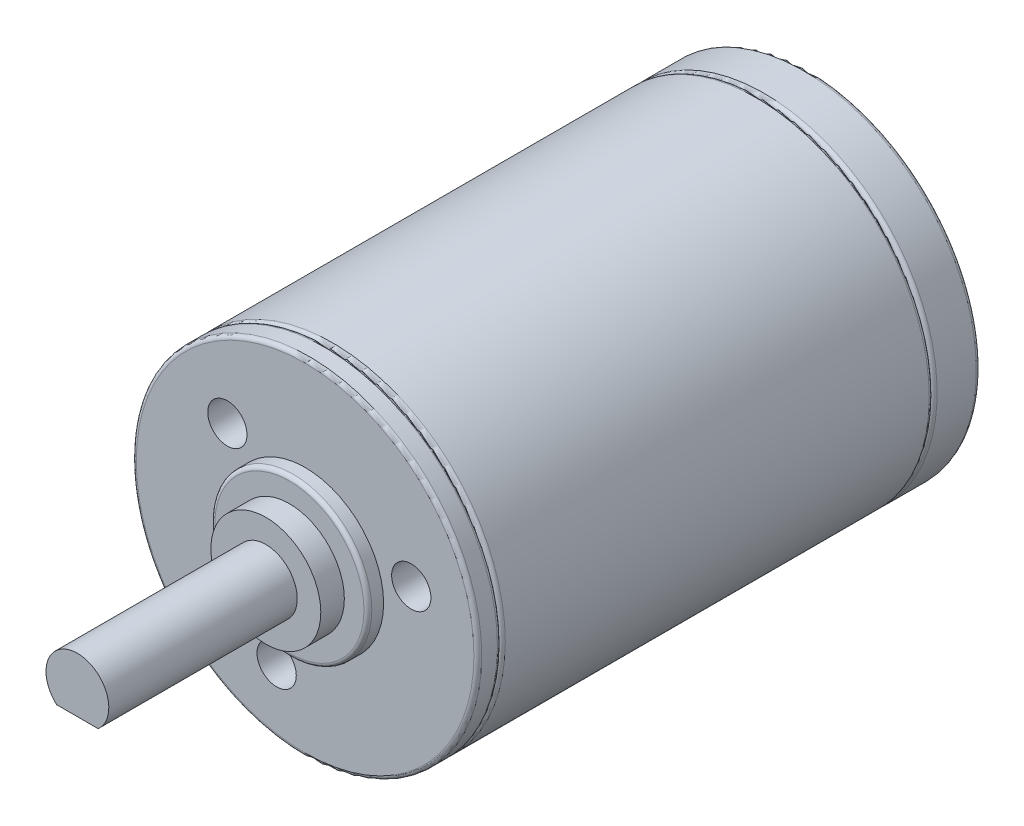
ISO-10303-21;
HEADER;
FILE_DESCRIPTION(('STEP AP214'),'2;1');
FILE_NAME('part.step','',(''),(''),'','','');
FILE_SCHEMA(('AUTOMOTIVE_DESIGN { 1 0 10303 214 1 1 1 1 }'));
ENDSEC;
DATA;
#1=APPLICATION_CONTEXT('core data for automotive mechanical design processes');
#2=APPLICATION_PROTOCOL_DEFINITION('international standard','automotive_design',2000,#1);
#3=PRODUCT_CONTEXT('',#1,'mechanical');
#4=PRODUCT('Part','Part','',(#3));
#5=PRODUCT_RELATED_PRODUCT_CATEGORY('part','',(#4));
#6=PRODUCT_DEFINITION_FORMATION('','',#4);
#7=PRODUCT_DEFINITION_CONTEXT('part definition',#1,'design');
#8=PRODUCT_DEFINITION('design','',#6,#7);
#9=PRODUCT_DEFINITION_SHAPE('','',#8);
#10=(LENGTH_UNIT() NAMED_UNIT(*) SI_UNIT(.MILLI.,.METRE.));
#11=(NAMED_UNIT(*) PLANE_ANGLE_UNIT() SI_UNIT($,.RADIAN.));
#12=(NAMED_UNIT(*) SI_UNIT($,.STERADIAN.) SOLID_ANGLE_UNIT());
#13=UNCERTAINTY_MEASURE_WITH_UNIT(LENGTH_MEASURE(1.E-05),#10,'distance_accuracy_value','');
#14=(GEOMETRIC_REPRESENTATION_CONTEXT(3) GLOBAL_UNCERTAINTY_ASSIGNED_CONTEXT((#13)) GLOBAL_UNIT_ASSIGNED_CONTEXT((#10,
#11,#12)) REPRESENTATION_CONTEXT('',''));
#15=CARTESIAN_POINT('',(0.,0.,0.));
#16=DIRECTION('',(0.,0.,1.));
#17=DIRECTION('',(1.,0.,0.));
#18=AXIS2_PLACEMENT_3D('',#15,#16,#17);
#19=CARTESIAN_POINT('',(0.,0.,31.5));
#20=DIRECTION('',(0.,0.,1.));
#21=DIRECTION('',(1.,0.,0.));
#22=AXIS2_PLACEMENT_3D('',#19,#20,#21);
#23=PLANE('',#22);
#24=CARTESIAN_POINT('',(0.,0.,31.5));
#25=DIRECTION('',(0.,0.,1.));
#26=DIRECTION('',(1.,0.,0.));
#27=AXIS2_PLACEMENT_3D('',#24,#25,#26);
#28=CIRCLE('',#27,3.5);
#29=CARTESIAN_POINT('',(3.5,0.,31.5));
#30=VERTEX_POINT('',#29);
#31=EDGE_CURVE('E77',#30,#30,#28,.T.);
#32=ORIENTED_EDGE('',*,*,#31,.T.);
#33=EDGE_LOOP('',(#32));
#34=FACE_BOUND('',#33,.T.);
#35=CARTESIAN_POINT('',(0.,0.,31.5));
#36=DIRECTION('',(0.,0.,1.));
#37=DIRECTION('',(1.,0.,0.));
#38=AXIS2_PLACEMENT_3D('',#35,#36,#37);
#39=CIRCLE('',#38,2.);
#40=CARTESIAN_POINT('',(2.,0.,31.5));
#41=VERTEX_POINT('',#40);
#42=EDGE_CURVE('E71',#41,#41,#39,.T.);
#43=ORIENTED_EDGE('',*,*,#42,.F.);
#44=EDGE_LOOP('',(#43));
#45=FACE_BOUND('',#44,.T.);
#46=ADVANCED_FACE('F32',(#34,#45),#23,.T.);
#47=CARTESIAN_POINT('',(0.,0.,30.));
#48=DIRECTION('',(0.,0.,1.));
#49=DIRECTION('',(1.,0.,0.));
#50=AXIS2_PLACEMENT_3D('',#47,#48,#49);
#51=PLANE('',#50);
#52=CARTESIAN_POINT('',(0.,0.,30.));
#53=DIRECTION('',(0.,0.,1.));
#54=DIRECTION('',(1.,0.,0.));
#55=AXIS2_PLACEMENT_3D('',#52,#53,#54);
#56=CIRCLE('',#55,4.75);
#57=CARTESIAN_POINT('',(4.75,0.,30.));
#58=VERTEX_POINT('',#57);
#59=EDGE_CURVE('E40',#58,#58,#56,.T.);
#60=ORIENTED_EDGE('',*,*,#59,.T.);
#61=EDGE_LOOP('',(#60));
#62=FACE_BOUND('',#61,.T.);
#63=CARTESIAN_POINT('',(0.,0.,30.));
#64=DIRECTION('',(0.,0.,1.));
#65=DIRECTION('',(1.,0.,0.));
#66=AXIS2_PLACEMENT_3D('',#63,#64,#65);
#67=CIRCLE('',#66,3.5);
#68=CARTESIAN_POINT('',(3.5,0.,30.));
#69=VERTEX_POINT('',#68);
#70=EDGE_CURVE('E74',#69,#69,#67,.T.);
#71=ORIENTED_EDGE('',*,*,#70,.F.);
#72=EDGE_LOOP('',(#71));
#73=FACE_BOUND('',#72,.T.);
#74=ADVANCED_FACE('F120',(#62,#73),#51,.T.);
#75=CARTESIAN_POINT('',(0.,0.,29.));
#76=DIRECTION('',(0.,0.,1.));
#77=DIRECTION('',(1.,0.,0.));
#78=AXIS2_PLACEMENT_3D('',#75,#76,#77);
#79=PLANE('',#78);
#80=CARTESIAN_POINT('',(-4.94974746830586,4.94974746830581,29.));
#81=DIRECTION('',(0.,0.,1.));
#82=DIRECTION('',(1.,0.,0.));
#83=AXIS2_PLACEMENT_3D('',#80,#81,#82);
#84=CIRCLE('',#83,1.25);
#85=CARTESIAN_POINT('',(-3.69974746830586,4.94974746830581,29.));
#86=VERTEX_POINT('',#85);
#87=EDGE_CURVE('E331',#86,#86,#84,.T.);
#88=ORIENTED_EDGE('',*,*,#87,.F.);
#89=EDGE_LOOP('',(#88));
#90=FACE_BOUND('',#89,.T.);
#91=CARTESIAN_POINT('',(-1.81173331571761,-6.76148078402349,29.));
#92=DIRECTION('',(0.,0.,1.));
#93=DIRECTION('',(1.,0.,0.));
#94=AXIS2_PLACEMENT_3D('',#91,#92,#93);
#95=CIRCLE('',#94,1.25);
#96=CARTESIAN_POINT('',(-0.561733315717613,-6.76148078402349,29.));
#97=VERTEX_POINT('',#96);
#98=EDGE_CURVE('E330',#97,#97,#95,.T.);
#99=ORIENTED_EDGE('',*,*,#98,.F.);
#100=EDGE_LOOP('',(#99));
#101=FACE_BOUND('',#100,.T.);
#102=CARTESIAN_POINT('',(6.76148078402347,1.81173331571767,29.));
#103=DIRECTION('',(0.,0.,1.));
#104=DIRECTION('',(1.,0.,0.));
#105=AXIS2_PLACEMENT_3D('',#102,#103,#104);
#106=CIRCLE('',#105,1.25);
#107=CARTESIAN_POINT('',(8.01148078402347,1.81173331571767,29.));
#108=VERTEX_POINT('',#107);
#109=EDGE_CURVE('E340',#108,#108,#106,.T.);
#110=ORIENTED_EDGE('',*,*,#109,.F.);
#111=EDGE_LOOP('',(#110));
#112=FACE_BOUND('',#111,.T.);
#113=CARTESIAN_POINT('',(0.,0.,29.));
#114=DIRECTION('',(0.,0.,1.));
#115=DIRECTION('',(1.,0.,0.));
#116=AXIS2_PLACEMENT_3D('',#113,#114,#115);
#117=CIRCLE('',#116,10.75);
#118=CARTESIAN_POINT('',(10.75,0.,29.));
#119=VERTEX_POINT('',#118);
#120=EDGE_CURVE('E115',#119,#119,#117,.T.);
#121=ORIENTED_EDGE('',*,*,#120,.T.);
#122=EDGE_LOOP('',(#121));
#123=FACE_BOUND('',#122,.T.);
#124=CARTESIAN_POINT('',(0.,0.,29.));
#125=DIRECTION('',(0.,0.,1.));
#126=DIRECTION('',(1.,0.,0.));
#127=AXIS2_PLACEMENT_3D('',#124,#125,#126);
#128=CIRCLE('',#127,5.);
#129=CARTESIAN_POINT('',(5.,0.,29.));
#130=VERTEX_POINT('',#129);
#131=EDGE_CURVE('E84',#130,#130,#128,.T.);
#132=ORIENTED_EDGE('',*,*,#131,.F.);
#133=EDGE_LOOP('',(#132));
#134=FACE_BOUND('',#133,.T.);
#135=ADVANCED_FACE('F143',(#90,#101,#112,#123,#134),#79,.T.);
#136=CARTESIAN_POINT('',(0.,0.,27.5));
#137=DIRECTION('',(0.,0.,-1.));
#138=DIRECTION('',(-1.,0.,0.));
#139=AXIS2_PLACEMENT_3D('',#136,#137,#138);
#140=CYLINDRICAL_SURFACE('',#139,11.);
#141=CARTESIAN_POINT('',(0.,0.,27.25));
#142=DIRECTION('',(0.,0.,1.));
#143=DIRECTION('',(1.,0.,0.));
#144=AXIS2_PLACEMENT_3D('',#141,#142,#143);
#145=CIRCLE('',#144,11.);
#146=CARTESIAN_POINT('',(11.,0.,27.25));
#147=VERTEX_POINT('',#146);
#148=EDGE_CURVE('E94',#147,#147,#145,.F.);
#149=ORIENTED_EDGE('',*,*,#148,.T.);
#150=EDGE_LOOP('',(#149));
#151=FACE_BOUND('',#150,.T.);
#152=CARTESIAN_POINT('',(0.,0.,0.25));
#153=DIRECTION('',(0.,0.,1.));
#154=DIRECTION('',(1.,0.,0.));
#155=AXIS2_PLACEMENT_3D('',#152,#153,#154);
#156=CIRCLE('',#155,11.);
#157=CARTESIAN_POINT('',(11.,0.,0.25));
#158=VERTEX_POINT('',#157);
#159=EDGE_CURVE('E91',#158,#158,#156,.T.);
#160=ORIENTED_EDGE('',*,*,#159,.T.);
#161=EDGE_LOOP('',(#160));
#162=FACE_BOUND('',#161,.T.);
#163=ADVANCED_FACE('F151',(#151,#162),#140,.T.);
#164=CARTESIAN_POINT('',(0.,0.,27.25));
#165=DIRECTION('',(0.,0.,1.));
#166=DIRECTION('',(1.,0.,0.));
#167=AXIS2_PLACEMENT_3D('',#164,#165,#166);
#168=TOROIDAL_SURFACE('',#167,10.75,0.25);
#169=ORIENTED_EDGE('',*,*,#148,.F.);
#170=EDGE_LOOP('',(#169));
#171=FACE_BOUND('',#170,.T.);
#172=CARTESIAN_POINT('',(0.,0.,27.5));
#173=DIRECTION('',(0.,0.,1.));
#174=DIRECTION('',(1.,0.,0.));
#175=AXIS2_PLACEMENT_3D('',#172,#173,#174);
#176=CIRCLE('',#175,10.75);
#177=CARTESIAN_POINT('',(10.75,0.,27.5));
#178=VERTEX_POINT('',#177);
#179=EDGE_CURVE('E88',#178,#178,#176,.T.);
#180=ORIENTED_EDGE('',*,*,#179,.F.);
#181=EDGE_LOOP('',(#180));
#182=FACE_BOUND('',#181,.T.);
#183=ADVANCED_FACE('F171',(#171,#182),#168,.T.);
#184=CARTESIAN_POINT('',(0.,0.,0.25));
#185=DIRECTION('',(0.,0.,1.));
#186=DIRECTION('',(1.,0.,0.));
#187=AXIS2_PLACEMENT_3D('',#184,#185,#186);
#188=TOROIDAL_SURFACE('',#187,10.75,0.25);
#189=CARTESIAN_POINT('',(0.,0.,0.));
#190=DIRECTION('',(0.,0.,1.));
#191=DIRECTION('',(1.,0.,0.));
#192=AXIS2_PLACEMENT_3D('',#189,#190,#191);
#193=CIRCLE('',#192,10.75);
#194=CARTESIAN_POINT('',(10.75,0.,0.));
#195=VERTEX_POINT('',#194);
#196=EDGE_CURVE('E97',#195,#195,#193,.F.);
#197=ORIENTED_EDGE('',*,*,#196,.F.);
#198=EDGE_LOOP('',(#197));
#199=FACE_BOUND('',#198,.T.);
#200=ORIENTED_EDGE('',*,*,#159,.F.);
#201=EDGE_LOOP('',(#200));
#202=FACE_BOUND('',#201,.T.);
#203=ADVANCED_FACE('F167',(#199,#202),#188,.T.);
#204=CARTESIAN_POINT('',(0.,0.,-3.));
#205=DIRECTION('',(0.,0.,1.));
#206=DIRECTION('',(1.,0.,0.));
#207=AXIS2_PLACEMENT_3D('',#204,#205,#206);
#208=CYLINDRICAL_SURFACE('',#207,11.);
#209=CARTESIAN_POINT('',(0.,0.,-2.75));
#210=DIRECTION('',(0.,0.,-1.));
#211=DIRECTION('',(-1.,0.,0.));
#212=AXIS2_PLACEMENT_3D('',#209,#210,#211);
#213=CIRCLE('',#212,11.);
#214=CARTESIAN_POINT('',(-11.,0.,-2.75));
#215=VERTEX_POINT('',#214);
#216=EDGE_CURVE('E106',#215,#215,#213,.F.);
#217=ORIENTED_EDGE('',*,*,#216,.T.);
#218=EDGE_LOOP('',(#217));
#219=FACE_BOUND('',#218,.T.);
#220=CARTESIAN_POINT('',(0.,0.,-0.25));
#221=DIRECTION('',(0.,0.,-1.));
#222=DIRECTION('',(-1.,0.,0.));
#223=AXIS2_PLACEMENT_3D('',#220,#221,#222);
#224=CIRCLE('',#223,11.);
#225=CARTESIAN_POINT('',(-11.,0.,-0.25));
#226=VERTEX_POINT('',#225);
#227=EDGE_CURVE('E103',#226,#226,#224,.T.);
#228=ORIENTED_EDGE('',*,*,#227,.T.);
#229=EDGE_LOOP('',(#228));
#230=FACE_BOUND('',#229,.T.);
#231=ADVANCED_FACE('F163',(#219,#230),#208,.T.);
#232=CARTESIAN_POINT('',(0.,0.,-3.));
#233=DIRECTION('',(0.,0.,-1.));
#234=DIRECTION('',(-1.,0.,0.));
#235=AXIS2_PLACEMENT_3D('',#232,#233,#234);
#236=PLANE('',#235);
#237=CARTESIAN_POINT('',(0.,0.,-3.));
#238=DIRECTION('',(0.,0.,-1.));
#239=DIRECTION('',(-1.,0.,0.));
#240=AXIS2_PLACEMENT_3D('',#237,#238,#239);
#241=CIRCLE('',#240,10.75);
#242=CARTESIAN_POINT('',(-10.75,0.,-3.));
#243=VERTEX_POINT('',#242);
#244=EDGE_CURVE('E100',#243,#243,#241,.T.);
#245=ORIENTED_EDGE('',*,*,#244,.T.);
#246=EDGE_LOOP('',(#245));
#247=FACE_BOUND('',#246,.T.);
#248=ADVANCED_FACE('F159',(#247),#236,.T.);
#249=CARTESIAN_POINT('',(0.,0.,-2.75));
#250=DIRECTION('',(0.,0.,-1.));
#251=DIRECTION('',(-1.,0.,0.));
#252=AXIS2_PLACEMENT_3D('',#249,#250,#251);
#253=TOROIDAL_SURFACE('',#252,10.75,0.25);
#254=ORIENTED_EDGE('',*,*,#216,.F.);
#255=EDGE_LOOP('',(#254));
#256=FACE_BOUND('',#255,.T.);
#257=ORIENTED_EDGE('',*,*,#244,.F.);
#258=EDGE_LOOP('',(#257));
#259=FACE_BOUND('',#258,.T.);
#260=ADVANCED_FACE('F162',(#256,#259),#253,.T.);
#261=CARTESIAN_POINT('',(0.,0.,-0.25));
#262=DIRECTION('',(0.,0.,-1.));
#263=DIRECTION('',(-1.,0.,0.));
#264=AXIS2_PLACEMENT_3D('',#261,#262,#263);
#265=TOROIDAL_SURFACE('',#264,10.75,0.25);
#266=ORIENTED_EDGE('',*,*,#196,.T.);
#267=EDGE_LOOP('',(#266));
#268=FACE_BOUND('',#267,.T.);
#269=ORIENTED_EDGE('',*,*,#227,.F.);
#270=EDGE_LOOP('',(#269));
#271=FACE_BOUND('',#270,.T.);
#272=ADVANCED_FACE('F157',(#268,#271),#265,.T.);
#273=CARTESIAN_POINT('',(0.,0.,29.));
#274=DIRECTION('',(0.,0.,-1.));
#275=DIRECTION('',(-1.,0.,0.));
#276=AXIS2_PLACEMENT_3D('',#273,#274,#275);
#277=CYLINDRICAL_SURFACE('',#276,11.);
#278=CARTESIAN_POINT('',(0.,0.,27.75));
#279=DIRECTION('',(0.,0.,1.));
#280=DIRECTION('',(1.,0.,0.));
#281=AXIS2_PLACEMENT_3D('',#278,#279,#280);
#282=CIRCLE('',#281,11.);
#283=CARTESIAN_POINT('',(11.,0.,27.75));
#284=VERTEX_POINT('',#283);
#285=EDGE_CURVE('E112',#284,#284,#282,.T.);
#286=ORIENTED_EDGE('',*,*,#285,.T.);
#287=EDGE_LOOP('',(#286));
#288=FACE_BOUND('',#287,.T.);
#289=CARTESIAN_POINT('',(0.,0.,28.75));
#290=DIRECTION('',(0.,0.,1.));
#291=DIRECTION('',(1.,0.,0.));
#292=AXIS2_PLACEMENT_3D('',#289,#290,#291);
#293=CIRCLE('',#292,11.);
#294=CARTESIAN_POINT('',(11.,0.,28.75));
#295=VERTEX_POINT('',#294);
#296=EDGE_CURVE('E109',#295,#295,#293,.F.);
#297=ORIENTED_EDGE('',*,*,#296,.T.);
#298=EDGE_LOOP('',(#297));
#299=FACE_BOUND('',#298,.T.);
#300=ADVANCED_FACE('F153',(#288,#299),#277,.T.);
#301=CARTESIAN_POINT('',(0.,0.,27.75));
#302=DIRECTION('',(0.,0.,1.));
#303=DIRECTION('',(1.,0.,0.));
#304=AXIS2_PLACEMENT_3D('',#301,#302,#303);
#305=TOROIDAL_SURFACE('',#304,10.75,0.25);
#306=ORIENTED_EDGE('',*,*,#179,.T.);
#307=EDGE_LOOP('',(#306));
#308=FACE_BOUND('',#307,.T.);
#309=ORIENTED_EDGE('',*,*,#285,.F.);
#310=EDGE_LOOP('',(#309));
#311=FACE_BOUND('',#310,.T.);
#312=ADVANCED_FACE('F156',(#308,#311),#305,.T.);
#313=CARTESIAN_POINT('',(0.,0.,28.75));
#314=DIRECTION('',(0.,0.,1.));
#315=DIRECTION('',(1.,0.,0.));
#316=AXIS2_PLACEMENT_3D('',#313,#314,#315);
#317=TOROIDAL_SURFACE('',#316,10.75,0.25);
#318=ORIENTED_EDGE('',*,*,#296,.F.);
#319=EDGE_LOOP('',(#318));
#320=FACE_BOUND('',#319,.T.);
#321=ORIENTED_EDGE('',*,*,#120,.F.);
#322=EDGE_LOOP('',(#321));
#323=FACE_BOUND('',#322,.T.);
#324=ADVANCED_FACE('F133',(#320,#323),#317,.T.);
#325=CARTESIAN_POINT('',(0.,0.,30.));
#326=DIRECTION('',(0.,0.,-1.));
#327=DIRECTION('',(-1.,0.,0.));
#328=AXIS2_PLACEMENT_3D('',#325,#326,#327);
#329=CYLINDRICAL_SURFACE('',#328,5.);
#330=CARTESIAN_POINT('',(0.,0.,29.75));
#331=DIRECTION('',(0.,0.,1.));
#332=DIRECTION('',(1.,0.,0.));
#333=AXIS2_PLACEMENT_3D('',#330,#331,#332);
#334=CIRCLE('',#333,5.);
#335=CARTESIAN_POINT('',(5.,0.,29.75));
#336=VERTEX_POINT('',#335);
#337=EDGE_CURVE('E11',#336,#336,#334,.F.);
#338=ORIENTED_EDGE('',*,*,#337,.T.);
#339=EDGE_LOOP('',(#338));
#340=FACE_BOUND('',#339,.T.);
#341=ORIENTED_EDGE('',*,*,#131,.T.);
#342=EDGE_LOOP('',(#341));
#343=FACE_BOUND('',#342,.T.);
#344=ADVANCED_FACE('F125',(#340,#343),#329,.T.);
#345=CARTESIAN_POINT('',(0.,0.,29.75));
#346=DIRECTION('',(0.,0.,1.));
#347=DIRECTION('',(1.,0.,0.));
#348=AXIS2_PLACEMENT_3D('',#345,#346,#347);
#349=TOROIDAL_SURFACE('',#348,4.75,0.25);
#350=ORIENTED_EDGE('',*,*,#337,.F.);
#351=EDGE_LOOP('',(#350));
#352=FACE_BOUND('',#351,.T.);
#353=ORIENTED_EDGE('',*,*,#59,.F.);
#354=EDGE_LOOP('',(#353));
#355=FACE_BOUND('',#354,.T.);
#356=ADVANCED_FACE('F34',(#352,#355),#349,.T.);
#357=CARTESIAN_POINT('',(0.,0.,31.5));
#358=DIRECTION('',(0.,0.,-1.));
#359=DIRECTION('',(-1.,0.,0.));
#360=AXIS2_PLACEMENT_3D('',#357,#358,#359);
#361=CYLINDRICAL_SURFACE('',#360,3.5);
#362=ORIENTED_EDGE('',*,*,#31,.F.);
#363=EDGE_LOOP('',(#362));
#364=FACE_BOUND('',#363,.T.);
#365=ORIENTED_EDGE('',*,*,#70,.T.);
#366=EDGE_LOOP('',(#365));
#367=FACE_BOUND('',#366,.T.);
#368=ADVANCED_FACE('F124',(#364,#367),#361,.T.);
#369=CARTESIAN_POINT('',(0.,0.,43.5));
#370=DIRECTION('',(0.,0.,-1.));
#371=DIRECTION('',(-1.,0.,0.));
#372=AXIS2_PLACEMENT_3D('',#369,#370,#371);
#373=CYLINDRICAL_SURFACE('',#372,2.);
#374=CARTESIAN_POINT('',(0.,0.,43.5));
#375=DIRECTION('',(0.,0.,1.));
#376=DIRECTION('',(1.,0.,0.));
#377=AXIS2_PLACEMENT_3D('',#374,#375,#376);
#378=CIRCLE('',#377,2.);
#379=CARTESIAN_POINT('',(1.3228756555323,-1.5,43.5));
#380=VERTEX_POINT('',#379);
#381=CARTESIAN_POINT('',(-1.3228756555323,-1.5,43.5));
#382=VERTEX_POINT('',#381);
#383=EDGE_CURVE('E70',#380,#382,#378,.T.);
#384=ORIENTED_EDGE('',*,*,#383,.F.);
#385=DIRECTION('',(0.,0.,1.));
#386=VECTOR('',#385,1.);
#387=CARTESIAN_POINT('',(1.3228756555323,-1.5,35.));
#388=LINE('',#387,#386);
#389=CARTESIAN_POINT('',(1.3228756555323,-1.5,35.));
#390=VERTEX_POINT('',#389);
#391=EDGE_CURVE('E47',#390,#380,#388,.T.);
#392=ORIENTED_EDGE('',*,*,#391,.F.);
#393=CARTESIAN_POINT('',(0.,0.,35.));
#394=DIRECTION('',(0.,0.,1.));
#395=DIRECTION('',(1.,0.,0.));
#396=AXIS2_PLACEMENT_3D('',#393,#394,#395);
#397=CIRCLE('',#396,2.);
#398=CARTESIAN_POINT('',(-1.3228756555323,-1.5,35.));
#399=VERTEX_POINT('',#398);
#400=EDGE_CURVE('E63',#399,#390,#397,.T.);
#401=ORIENTED_EDGE('',*,*,#400,.F.);
#402=DIRECTION('',(0.,0.,1.));
#403=VECTOR('',#402,1.);
#404=CARTESIAN_POINT('',(-1.3228756555323,-1.5,35.));
#405=LINE('',#404,#403);
#406=EDGE_CURVE('E53',#399,#382,#405,.T.);
#407=ORIENTED_EDGE('',*,*,#406,.T.);
#408=EDGE_LOOP('',(#384,#392,#401,#407));
#409=FACE_BOUND('',#408,.T.);
#410=ORIENTED_EDGE('',*,*,#42,.T.);
#411=EDGE_LOOP('',(#410));
#412=FACE_BOUND('',#411,.T.);
#413=ADVANCED_FACE('F68',(#409,#412),#373,.T.);
#414=CARTESIAN_POINT('',(0.,0.,43.5));
#415=DIRECTION('',(0.,0.,1.));
#416=DIRECTION('',(1.,0.,0.));
#417=AXIS2_PLACEMENT_3D('',#414,#415,#416);
#418=PLANE('',#417);
#419=DIRECTION('',(-1.,0.,0.));
#420=VECTOR('',#419,1.);
#421=CARTESIAN_POINT('',(-1.3228756555323,-1.5,43.5));
#422=LINE('',#421,#420);
#423=EDGE_CURVE('E58',#380,#382,#422,.T.);
#424=ORIENTED_EDGE('',*,*,#423,.F.);
#425=ORIENTED_EDGE('',*,*,#383,.T.);
#426=EDGE_LOOP('',(#424,#425));
#427=FACE_BOUND('',#426,.T.);
#428=ADVANCED_FACE('F73',(#427),#418,.T.);
#429=CARTESIAN_POINT('',(-1.3228756555323,-1.5,35.));
#430=DIRECTION('',(0.,1.,0.));
#431=DIRECTION('',(0.,0.,1.));
#432=AXIS2_PLACEMENT_3D('',#429,#430,#431);
#433=PLANE('',#432);
#434=ORIENTED_EDGE('',*,*,#423,.T.);
#435=ORIENTED_EDGE('',*,*,#406,.F.);
#436=DIRECTION('',(-1.,0.,0.));
#437=VECTOR('',#436,1.);
#438=CARTESIAN_POINT('',(-1.3228756555323,-1.5,35.));
#439=LINE('',#438,#437);
#440=EDGE_CURVE('E347',#390,#399,#439,.T.);
#441=ORIENTED_EDGE('',*,*,#440,.F.);
#442=ORIENTED_EDGE('',*,*,#391,.T.);
#443=EDGE_LOOP('',(#434,#435,#441,#442));
#444=FACE_BOUND('',#443,.T.);
#445=ADVANCED_FACE('F59',(#444),#433,.F.);
#446=CARTESIAN_POINT('',(0.,0.,35.));
#447=DIRECTION('',(0.,0.,1.));
#448=DIRECTION('',(1.,0.,0.));
#449=AXIS2_PLACEMENT_3D('',#446,#447,#448);
#450=PLANE('',#449);
#451=ORIENTED_EDGE('',*,*,#400,.T.);
#452=ORIENTED_EDGE('',*,*,#440,.T.);
#453=EDGE_LOOP('',(#451,#452));
#454=FACE_BOUND('',#453,.T.);
#455=ADVANCED_FACE('F249',(#454),#450,.T.);
#456=CARTESIAN_POINT('',(6.76148078402347,1.81173331571767,26.));
#457=DIRECTION('',(0.,0.,1.));
#458=DIRECTION('',(1.,0.,0.));
#459=AXIS2_PLACEMENT_3D('',#456,#457,#458);
#460=CYLINDRICAL_SURFACE('',#459,1.25);
#461=CARTESIAN_POINT('',(6.76148078402347,1.81173331571767,26.));
#462=DIRECTION('',(0.,0.,1.));
#463=DIRECTION('',(1.,0.,0.));
#464=AXIS2_PLACEMENT_3D('',#461,#462,#463);
#465=CIRCLE('',#464,1.25);
#466=CARTESIAN_POINT('',(8.01148078402347,1.81173331571767,26.));
#467=VERTEX_POINT('',#466);
#468=EDGE_CURVE('E64',#467,#467,#465,.T.);
#469=ORIENTED_EDGE('',*,*,#468,.F.);
#470=EDGE_LOOP('',(#469));
#471=FACE_BOUND('',#470,.T.);
#472=ORIENTED_EDGE('',*,*,#109,.T.);
#473=EDGE_LOOP('',(#472));
#474=FACE_BOUND('',#473,.T.);
#475=ADVANCED_FACE('F258',(#471,#474),#460,.F.);
#476=CARTESIAN_POINT('',(6.76148078402347,1.81173331571767,26.));
#477=DIRECTION('',(0.,0.,1.));
#478=DIRECTION('',(1.,0.,0.));
#479=AXIS2_PLACEMENT_3D('',#476,#477,#478);
#480=PLANE('',#479);
#481=ORIENTED_EDGE('',*,*,#468,.T.);
#482=EDGE_LOOP('',(#481));
#483=FACE_BOUND('',#482,.T.);
#484=ADVANCED_FACE('F273',(#483),#480,.T.);
#485=CARTESIAN_POINT('',(-1.81173331571761,-6.76148078402349,26.));
#486=DIRECTION('',(0.,0.,1.));
#487=DIRECTION('',(1.,0.,0.));
#488=AXIS2_PLACEMENT_3D('',#485,#486,#487);
#489=CYLINDRICAL_SURFACE('',#488,1.25);
#490=CARTESIAN_POINT('',(-1.81173331571761,-6.76148078402349,26.));
#491=DIRECTION('',(0.,0.,1.));
#492=DIRECTION('',(1.,0.,0.));
#493=AXIS2_PLACEMENT_3D('',#490,#491,#492);
#494=CIRCLE('',#493,1.25);
#495=CARTESIAN_POINT('',(-0.561733315717613,-6.76148078402349,26.));
#496=VERTEX_POINT('',#495);
#497=EDGE_CURVE('E334',#496,#496,#494,.T.);
#498=ORIENTED_EDGE('',*,*,#497,.F.);
#499=EDGE_LOOP('',(#498));
#500=FACE_BOUND('',#499,.T.);
#501=ORIENTED_EDGE('',*,*,#98,.T.);
#502=EDGE_LOOP('',(#501));
#503=FACE_BOUND('',#502,.T.);
#504=ADVANCED_FACE('F283',(#500,#503),#489,.F.);
#505=CARTESIAN_POINT('',(-1.81173331571761,-6.76148078402349,26.));
#506=DIRECTION('',(0.,0.,1.));
#507=DIRECTION('',(1.,0.,0.));
#508=AXIS2_PLACEMENT_3D('',#505,#506,#507);
#509=PLANE('',#508);
#510=ORIENTED_EDGE('',*,*,#497,.T.);
#511=EDGE_LOOP('',(#510));
#512=FACE_BOUND('',#511,.T.);
#513=ADVANCED_FACE('F293',(#512),#509,.T.);
#514=CARTESIAN_POINT('',(-4.94974746830586,4.94974746830581,26.));
#515=DIRECTION('',(0.,0.,1.));
#516=DIRECTION('',(1.,0.,0.));
#517=AXIS2_PLACEMENT_3D('',#514,#515,#516);
#518=CYLINDRICAL_SURFACE('',#517,1.25);
#519=CARTESIAN_POINT('',(-4.94974746830586,4.94974746830581,26.));
#520=DIRECTION('',(0.,0.,1.));
#521=DIRECTION('',(1.,0.,0.));
#522=AXIS2_PLACEMENT_3D('',#519,#520,#521);
#523=CIRCLE('',#522,1.25);
#524=CARTESIAN_POINT('',(-3.69974746830586,4.94974746830581,26.));
#525=VERTEX_POINT('',#524);
#526=EDGE_CURVE('E329',#525,#525,#523,.T.);
#527=ORIENTED_EDGE('',*,*,#526,.F.);
#528=EDGE_LOOP('',(#527));
#529=FACE_BOUND('',#528,.T.);
#530=ORIENTED_EDGE('',*,*,#87,.T.);
#531=EDGE_LOOP('',(#530));
#532=FACE_BOUND('',#531,.T.);
#533=ADVANCED_FACE('F303',(#529,#532),#518,.F.);
#534=CARTESIAN_POINT('',(-4.94974746830586,4.94974746830581,26.));
#535=DIRECTION('',(0.,0.,1.));
#536=DIRECTION('',(1.,0.,0.));
#537=AXIS2_PLACEMENT_3D('',#534,#535,#536);
#538=PLANE('',#537);
#539=ORIENTED_EDGE('',*,*,#526,.T.);
#540=EDGE_LOOP('',(#539));
#541=FACE_BOUND('',#540,.T.);
#542=ADVANCED_FACE('F313',(#541),#538,.T.);
#543=CLOSED_SHELL('',(#46,#74,#135,#163,#183,#203,#231,#248,#260,#272,#300,#312,#324,#344,#356,
#368,#413,#428,#445,#455,#475,#484,#504,#513,#533,#542));
#544=MANIFOLD_SOLID_BREP('B2',#543);
#545=ADVANCED_BREP_SHAPE_REPRESENTATION('',(#18,#544),#14);
#546=SHAPE_DEFINITION_REPRESENTATION(#9,#545);
ENDSEC;
END-ISO-10303-21;
